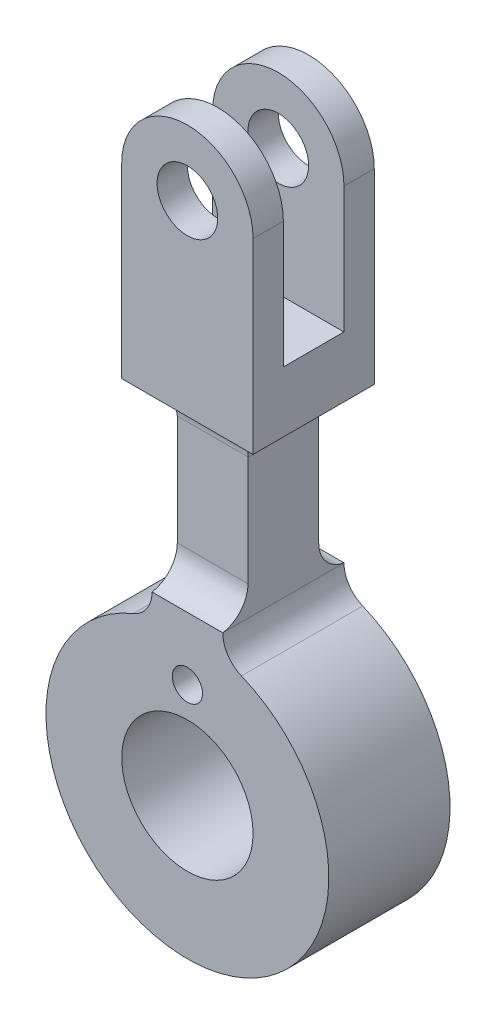
ISO-10303-21;
HEADER;
FILE_DESCRIPTION(('STEP AP214'),'2;1');
FILE_NAME('part.step','',(''),(''),'','','');
FILE_SCHEMA(('AUTOMOTIVE_DESIGN { 1 0 10303 214 1 1 1 1 }'));
ENDSEC;
DATA;
#1=APPLICATION_CONTEXT('core data for automotive mechanical design processes');
#2=APPLICATION_PROTOCOL_DEFINITION('international standard','automotive_design',2000,#1);
#3=PRODUCT_CONTEXT('',#1,'mechanical');
#4=PRODUCT('Part','Part','',(#3));
#5=PRODUCT_RELATED_PRODUCT_CATEGORY('part','',(#4));
#6=PRODUCT_DEFINITION_FORMATION('','',#4);
#7=PRODUCT_DEFINITION_CONTEXT('part definition',#1,'design');
#8=PRODUCT_DEFINITION('design','',#6,#7);
#9=PRODUCT_DEFINITION_SHAPE('','',#8);
#10=(LENGTH_UNIT() NAMED_UNIT(*) SI_UNIT(.MILLI.,.METRE.));
#11=(NAMED_UNIT(*) PLANE_ANGLE_UNIT() SI_UNIT($,.RADIAN.));
#12=(NAMED_UNIT(*) SI_UNIT($,.STERADIAN.) SOLID_ANGLE_UNIT());
#13=UNCERTAINTY_MEASURE_WITH_UNIT(LENGTH_MEASURE(1.E-05),#10,'distance_accuracy_value','');
#14=(GEOMETRIC_REPRESENTATION_CONTEXT(3) GLOBAL_UNCERTAINTY_ASSIGNED_CONTEXT((#13)) GLOBAL_UNIT_ASSIGNED_CONTEXT((#10,
#11,#12)) REPRESENTATION_CONTEXT('',''));
#15=CARTESIAN_POINT('',(0.,0.,0.));
#16=DIRECTION('',(0.,0.,1.));
#17=DIRECTION('',(1.,0.,0.));
#18=AXIS2_PLACEMENT_3D('',#15,#16,#17);
#19=CARTESIAN_POINT('',(-6.5,29.4999999999939,6.));
#20=DIRECTION('',(0.,0.,1.));
#21=DIRECTION('',(1.,0.,0.));
#22=AXIS2_PLACEMENT_3D('',#19,#20,#21);
#23=PLANE('',#22);
#24=DIRECTION('',(1.,0.,0.));
#25=VECTOR('',#24,1.);
#26=CARTESIAN_POINT('',(-14.,32.4999999999939,6.));
#27=LINE('',#26,#25);
#28=CARTESIAN_POINT('',(-6.5,32.4999999999939,6.));
#29=VERTEX_POINT('',#28);
#30=CARTESIAN_POINT('',(6.49999999999999,32.4999999999939,6.));
#31=VERTEX_POINT('',#30);
#32=EDGE_CURVE('E274',#29,#31,#27,.T.);
#33=ORIENTED_EDGE('',*,*,#32,.T.);
#34=DIRECTION('',(0.,1.,0.));
#35=VECTOR('',#34,1.);
#36=CARTESIAN_POINT('',(6.49999999999999,32.4999999999939,6.));
#37=LINE('',#36,#35);
#38=CARTESIAN_POINT('',(6.5,51.,6.));
#39=VERTEX_POINT('',#38);
#40=EDGE_CURVE('E309',#31,#39,#37,.T.);
#41=ORIENTED_EDGE('',*,*,#40,.T.);
#42=CARTESIAN_POINT('',(0.,50.9999999999939,6.));
#43=DIRECTION('',(0.,0.,1.));
#44=DIRECTION('',(-1.,0.,0.));
#45=AXIS2_PLACEMENT_3D('',#42,#43,#44);
#46=CIRCLE('',#45,6.5);
#47=CARTESIAN_POINT('',(-6.5,51.,6.));
#48=VERTEX_POINT('',#47);
#49=EDGE_CURVE('E311',#39,#48,#46,.T.);
#50=ORIENTED_EDGE('',*,*,#49,.T.);
#51=DIRECTION('',(0.,-1.,0.));
#52=VECTOR('',#51,1.);
#53=CARTESIAN_POINT('',(-6.5,32.4999999999939,6.));
#54=LINE('',#53,#52);
#55=EDGE_CURVE('E313',#48,#29,#54,.T.);
#56=ORIENTED_EDGE('',*,*,#55,.T.);
#57=EDGE_LOOP('',(#33,#41,#50,#56));
#58=FACE_BOUND('',#57,.T.);
#59=CARTESIAN_POINT('',(0.,50.9999999999939,6.));
#60=DIRECTION('',(0.,0.,1.));
#61=DIRECTION('',(1.,0.,0.));
#62=AXIS2_PLACEMENT_3D('',#59,#60,#61);
#63=CIRCLE('',#62,3.);
#64=CARTESIAN_POINT('',(3.,50.9999999999939,6.));
#65=VERTEX_POINT('',#64);
#66=EDGE_CURVE('E278',#65,#65,#63,.T.);
#67=ORIENTED_EDGE('',*,*,#66,.F.);
#68=EDGE_LOOP('',(#67));
#69=FACE_BOUND('',#68,.T.);
#70=ADVANCED_FACE('F33',(#58,#69),#23,.T.);
#71=CARTESIAN_POINT('',(-6.5,29.4999999999939,-6.));
#72=DIRECTION('',(0.,0.,1.));
#73=DIRECTION('',(1.,0.,0.));
#74=AXIS2_PLACEMENT_3D('',#71,#72,#73);
#75=PLANE('',#74);
#76=CARTESIAN_POINT('',(0.,9.5,-6.));
#77=DIRECTION('',(0.,0.,1.));
#78=DIRECTION('',(1.,0.,0.));
#79=AXIS2_PLACEMENT_3D('',#76,#77,#78);
#80=CIRCLE('',#79,1.5);
#81=CARTESIAN_POINT('',(1.5,9.5,-6.));
#82=VERTEX_POINT('',#81);
#83=EDGE_CURVE('E280',#82,#82,#80,.T.);
#84=ORIENTED_EDGE('',*,*,#83,.T.);
#85=EDGE_LOOP('',(#84));
#86=FACE_BOUND('',#85,.T.);
#87=CARTESIAN_POINT('',(0.,0.,-6.));
#88=DIRECTION('',(0.,0.,1.));
#89=DIRECTION('',(1.,0.,0.));
#90=AXIS2_PLACEMENT_3D('',#87,#88,#89);
#91=CIRCLE('',#90,6.5);
#92=CARTESIAN_POINT('',(6.5,0.,-6.));
#93=VERTEX_POINT('',#92);
#94=EDGE_CURVE('E293',#93,#93,#91,.T.);
#95=ORIENTED_EDGE('',*,*,#94,.T.);
#96=EDGE_LOOP('',(#95));
#97=FACE_BOUND('',#96,.T.);
#98=CARTESIAN_POINT('',(-6.5,15.708278072405,-6.));
#99=DIRECTION('',(0.,0.,-1.));
#100=DIRECTION('',(-1.,0.,0.));
#101=AXIS2_PLACEMENT_3D('',#98,#99,#100);
#102=CIRCLE('',#101,3.);
#103=CARTESIAN_POINT('',(-3.5,15.708278072405,-6.));
#104=VERTEX_POINT('',#103);
#105=CARTESIAN_POINT('',(-5.35294117647059,12.9362290008041,-6.));
#106=VERTEX_POINT('',#105);
#107=EDGE_CURVE('E298',#104,#106,#102,.T.);
#108=ORIENTED_EDGE('',*,*,#107,.F.);
#109=DIRECTION('',(1.,0.,0.));
#110=VECTOR('',#109,1.);
#111=CARTESIAN_POINT('',(-14.,15.708278072405,-6.));
#112=LINE('',#111,#110);
#113=CARTESIAN_POINT('',(3.5,15.708278072405,-6.));
#114=VERTEX_POINT('',#113);
#115=EDGE_CURVE('E381',#104,#114,#112,.T.);
#116=ORIENTED_EDGE('',*,*,#115,.T.);
#117=CARTESIAN_POINT('',(6.5,15.708278072405,-6.));
#118=DIRECTION('',(0.,0.,-1.));
#119=DIRECTION('',(1.,0.,0.));
#120=AXIS2_PLACEMENT_3D('',#117,#118,#119);
#121=CIRCLE('',#120,3.);
#122=CARTESIAN_POINT('',(5.35294117647059,12.9362290008041,-6.));
#123=VERTEX_POINT('',#122);
#124=EDGE_CURVE('E319',#123,#114,#121,.T.);
#125=ORIENTED_EDGE('',*,*,#124,.F.);
#126=CARTESIAN_POINT('',(0.,0.,-6.));
#127=DIRECTION('',(0.,0.,1.));
#128=DIRECTION('',(1.,0.,0.));
#129=AXIS2_PLACEMENT_3D('',#126,#127,#128);
#130=CIRCLE('',#129,14.);
#131=EDGE_CURVE('E317',#106,#123,#130,.T.);
#132=ORIENTED_EDGE('',*,*,#131,.F.);
#133=EDGE_LOOP('',(#108,#116,#125,#132));
#134=FACE_BOUND('',#133,.T.);
#135=ADVANCED_FACE('F251',(#86,#97,#134),#75,.F.);
#136=CARTESIAN_POINT('',(0.,50.9999999999939,6.));
#137=DIRECTION('',(0.,0.,-1.));
#138=DIRECTION('',(-1.,0.,0.));
#139=AXIS2_PLACEMENT_3D('',#136,#137,#138);
#140=CYLINDRICAL_SURFACE('',#139,6.5);
#141=CARTESIAN_POINT('',(0.,50.9999999999939,3.));
#142=DIRECTION('',(0.,0.,1.));
#143=DIRECTION('',(1.,0.,0.));
#144=AXIS2_PLACEMENT_3D('',#141,#142,#143);
#145=CIRCLE('',#144,6.5);
#146=CARTESIAN_POINT('',(6.5,50.9999999999939,3.));
#147=VERTEX_POINT('',#146);
#148=CARTESIAN_POINT('',(-6.5,51.,3.));
#149=VERTEX_POINT('',#148);
#150=EDGE_CURVE('E161',#147,#149,#145,.T.);
#151=ORIENTED_EDGE('',*,*,#150,.T.);
#152=DIRECTION('',(0.,0.,-1.));
#153=VECTOR('',#152,1.);
#154=CARTESIAN_POINT('',(-6.5,51.,6.));
#155=LINE('',#154,#153);
#156=EDGE_CURVE('E333',#48,#149,#155,.T.);
#157=ORIENTED_EDGE('',*,*,#156,.F.);
#158=ORIENTED_EDGE('',*,*,#49,.F.);
#159=DIRECTION('',(0.,0.,-1.));
#160=VECTOR('',#159,1.);
#161=CARTESIAN_POINT('',(6.5,51.,6.));
#162=LINE('',#161,#160);
#163=EDGE_CURVE('E337',#39,#147,#162,.T.);
#164=ORIENTED_EDGE('',*,*,#163,.T.);
#165=EDGE_LOOP('',(#151,#157,#158,#164));
#166=FACE_BOUND('',#165,.T.);
#167=ADVANCED_FACE('F258',(#166),#140,.T.);
#168=CARTESIAN_POINT('',(0.,50.9999999999939,6.));
#169=DIRECTION('',(0.,0.,-1.));
#170=DIRECTION('',(-1.,0.,0.));
#171=AXIS2_PLACEMENT_3D('',#168,#169,#170);
#172=CYLINDRICAL_SURFACE('',#171,3.);
#173=CARTESIAN_POINT('',(0.,50.9999999999939,-3.));
#174=DIRECTION('',(0.,0.,-1.));
#175=DIRECTION('',(-1.,0.,0.));
#176=AXIS2_PLACEMENT_3D('',#173,#174,#175);
#177=CIRCLE('',#176,3.);
#178=CARTESIAN_POINT('',(-3.,50.9999999999939,-3.));
#179=VERTEX_POINT('',#178);
#180=EDGE_CURVE('E166',#179,#179,#177,.T.);
#181=ORIENTED_EDGE('',*,*,#180,.F.);
#182=EDGE_LOOP('',(#181));
#183=FACE_BOUND('',#182,.T.);
#184=CARTESIAN_POINT('',(0.,50.9999999999939,-6.));
#185=DIRECTION('',(0.,0.,1.));
#186=DIRECTION('',(1.,0.,0.));
#187=AXIS2_PLACEMENT_3D('',#184,#185,#186);
#188=CIRCLE('',#187,3.);
#189=CARTESIAN_POINT('',(3.,50.9999999999939,-6.));
#190=VERTEX_POINT('',#189);
#191=EDGE_CURVE('E281',#190,#190,#188,.T.);
#192=ORIENTED_EDGE('',*,*,#191,.F.);
#193=EDGE_LOOP('',(#192));
#194=FACE_BOUND('',#193,.T.);
#195=ADVANCED_FACE('F234',(#183,#194),#172,.F.);
#196=DIRECTION('',(1.,0.,0.));
#197=VECTOR('',#196,1.);
#198=CARTESIAN_POINT('',(-14.,15.708278072405,6.));
#199=LINE('',#198,#197);
#200=CARTESIAN_POINT('',(-3.5,15.708278072405,6.));
#201=VERTEX_POINT('',#200);
#202=CARTESIAN_POINT('',(3.5,15.708278072405,6.));
#203=VERTEX_POINT('',#202);
#204=EDGE_CURVE('E451',#201,#203,#199,.T.);
#205=ORIENTED_EDGE('',*,*,#204,.F.);
#206=CARTESIAN_POINT('',(-6.5,15.708278072405,6.));
#207=DIRECTION('',(0.,0.,-1.));
#208=DIRECTION('',(-1.,0.,0.));
#209=AXIS2_PLACEMENT_3D('',#206,#207,#208);
#210=CIRCLE('',#209,3.);
#211=CARTESIAN_POINT('',(-5.35294117647059,12.9362290008041,6.));
#212=VERTEX_POINT('',#211);
#213=EDGE_CURVE('E301',#201,#212,#210,.T.);
#214=ORIENTED_EDGE('',*,*,#213,.T.);
#215=CARTESIAN_POINT('',(0.,0.,6.));
#216=DIRECTION('',(0.,0.,1.));
#217=DIRECTION('',(1.,0.,0.));
#218=AXIS2_PLACEMENT_3D('',#215,#216,#217);
#219=CIRCLE('',#218,14.);
#220=CARTESIAN_POINT('',(5.35294117647059,12.9362290008041,6.));
#221=VERTEX_POINT('',#220);
#222=EDGE_CURVE('E303',#212,#221,#219,.T.);
#223=ORIENTED_EDGE('',*,*,#222,.T.);
#224=CARTESIAN_POINT('',(6.5,15.708278072405,6.));
#225=DIRECTION('',(0.,0.,-1.));
#226=DIRECTION('',(1.,0.,0.));
#227=AXIS2_PLACEMENT_3D('',#224,#225,#226);
#228=CIRCLE('',#227,3.);
#229=EDGE_CURVE('E306',#221,#203,#228,.T.);
#230=ORIENTED_EDGE('',*,*,#229,.T.);
#231=EDGE_LOOP('',(#205,#214,#223,#230));
#232=FACE_BOUND('',#231,.T.);
#233=CARTESIAN_POINT('',(0.,9.5,6.));
#234=DIRECTION('',(0.,0.,1.));
#235=DIRECTION('',(1.,0.,0.));
#236=AXIS2_PLACEMENT_3D('',#233,#234,#235);
#237=CIRCLE('',#236,1.5);
#238=CARTESIAN_POINT('',(1.5,9.5,6.));
#239=VERTEX_POINT('',#238);
#240=EDGE_CURVE('E284',#239,#239,#237,.T.);
#241=ORIENTED_EDGE('',*,*,#240,.F.);
#242=EDGE_LOOP('',(#241));
#243=FACE_BOUND('',#242,.T.);
#244=CARTESIAN_POINT('',(0.,0.,6.));
#245=DIRECTION('',(0.,0.,1.));
#246=DIRECTION('',(1.,0.,0.));
#247=AXIS2_PLACEMENT_3D('',#244,#245,#246);
#248=CIRCLE('',#247,6.5);
#249=CARTESIAN_POINT('',(6.5,0.,6.));
#250=VERTEX_POINT('',#249);
#251=EDGE_CURVE('E295',#250,#250,#248,.T.);
#252=ORIENTED_EDGE('',*,*,#251,.F.);
#253=EDGE_LOOP('',(#252));
#254=FACE_BOUND('',#253,.T.);
#255=ADVANCED_FACE('F243',(#232,#243,#254),#23,.T.);
#256=DIRECTION('',(0.,1.,0.));
#257=VECTOR('',#256,1.);
#258=CARTESIAN_POINT('',(6.49999999999999,32.4999999999939,-6.));
#259=LINE('',#258,#257);
#260=CARTESIAN_POINT('',(6.49999999999999,32.4999999999939,-6.));
#261=VERTEX_POINT('',#260);
#262=CARTESIAN_POINT('',(6.5,51.,-6.));
#263=VERTEX_POINT('',#262);
#264=EDGE_CURVE('E322',#261,#263,#259,.T.);
#265=ORIENTED_EDGE('',*,*,#264,.F.);
#266=DIRECTION('',(1.,0.,0.));
#267=VECTOR('',#266,1.);
#268=CARTESIAN_POINT('',(-14.,32.4999999999939,-6.));
#269=LINE('',#268,#267);
#270=CARTESIAN_POINT('',(-6.5,32.4999999999939,-6.));
#271=VERTEX_POINT('',#270);
#272=EDGE_CURVE('E389',#271,#261,#269,.T.);
#273=ORIENTED_EDGE('',*,*,#272,.F.);
#274=DIRECTION('',(0.,-1.,0.));
#275=VECTOR('',#274,1.);
#276=CARTESIAN_POINT('',(-6.5,32.4999999999939,-6.));
#277=LINE('',#276,#275);
#278=CARTESIAN_POINT('',(-6.5,51.,-6.));
#279=VERTEX_POINT('',#278);
#280=EDGE_CURVE('E304',#279,#271,#277,.T.);
#281=ORIENTED_EDGE('',*,*,#280,.F.);
#282=CARTESIAN_POINT('',(0.,50.9999999999939,-6.));
#283=DIRECTION('',(0.,0.,1.));
#284=DIRECTION('',(-1.,0.,0.));
#285=AXIS2_PLACEMENT_3D('',#282,#283,#284);
#286=CIRCLE('',#285,6.5);
#287=EDGE_CURVE('E325',#263,#279,#286,.T.);
#288=ORIENTED_EDGE('',*,*,#287,.F.);
#289=EDGE_LOOP('',(#265,#273,#281,#288));
#290=FACE_BOUND('',#289,.T.);
#291=ORIENTED_EDGE('',*,*,#191,.T.);
#292=EDGE_LOOP('',(#291));
#293=FACE_BOUND('',#292,.T.);
#294=ADVANCED_FACE('F246',(#290,#293),#75,.F.);
#295=CARTESIAN_POINT('',(-6.5,29.4999999999939,6.));
#296=DIRECTION('',(0.,0.,-1.));
#297=DIRECTION('',(-1.,0.,0.));
#298=AXIS2_PLACEMENT_3D('',#295,#296,#297);
#299=CYLINDRICAL_SURFACE('',#298,3.);
#300=CARTESIAN_POINT('',(-6.5,29.4999999999939,3.5));
#301=DIRECTION('',(0.,0.,-1.));
#302=DIRECTION('',(0.,1.,0.));
#303=AXIS2_PLACEMENT_3D('',#300,#301,#302);
#304=CIRCLE('',#303,3.);
#305=CARTESIAN_POINT('',(-3.5,29.4999999999939,3.5));
#306=VERTEX_POINT('',#305);
#307=CARTESIAN_POINT('',(-3.50029345613628,29.541960108444,3.5));
#308=VERTEX_POINT('',#307);
#309=EDGE_CURVE('E410',#306,#308,#304,.F.);
#310=ORIENTED_EDGE('',*,*,#309,.T.);
#311=CARTESIAN_POINT('',(-3.5,29.4999999999939,3.50029345613627));
#312=CARTESIAN_POINT('',(-3.49998330334828,29.5669979029651,3.49933962570523));
#313=CARTESIAN_POINT('',(-3.50224380190486,29.6340158062412,3.50066330146135));
#314=CARTESIAN_POINT('',(-3.51120380816069,29.7674695918802,3.50774655918405));
#315=CARTESIAN_POINT('',(-3.51789999505206,29.8339058720074,3.51350282318705));
#316=CARTESIAN_POINT('',(-3.53554263562656,29.9651283345654,3.52926525332445));
#317=CARTESIAN_POINT('',(-3.54645327654144,30.0299236453092,3.53923567474066));
#318=CARTESIAN_POINT('',(-3.57230617983571,30.1579356350321,3.56319545782947));
#319=CARTESIAN_POINT('',(-3.58724897796362,30.2211521030115,3.57718535358141));
#320=CARTESIAN_POINT('',(-3.63765399990194,30.4074398284925,3.62471014034317));
#321=CARTESIAN_POINT('',(-3.67875994295202,30.5276285780625,3.66386052293696));
#322=CARTESIAN_POINT('',(-3.77360971153534,30.7579343447238,3.75467284927776));
#323=CARTESIAN_POINT('',(-3.82737997423332,30.8680296142028,3.80636097279133));
#324=CARTESIAN_POINT('',(-3.96869055730461,31.1188430816549,3.9424376052017));
#325=CARTESIAN_POINT('',(-4.06113464593573,31.254188917427,4.03163522097977));
#326=CARTESIAN_POINT('',(-4.26057583711766,31.5026192594445,4.22390543525591));
#327=CARTESIAN_POINT('',(-4.36760745724802,31.6156493594406,4.32701093699152));
#328=CARTESIAN_POINT('',(-4.55742323659217,31.7885346654323,4.50916459262957));
#329=CARTESIAN_POINT('',(-4.6374899334485,31.8540324877647,4.58581089869139));
#330=CARTESIAN_POINT('',(-4.80182117828821,31.9752008519672,4.74240433545194));
#331=CARTESIAN_POINT('',(-4.88608782060196,32.0308664267696,4.82235310947606));
#332=CARTESIAN_POINT('',(-5.0580821044487,32.1326500656003,4.98426284082733));
#333=CARTESIAN_POINT('',(-5.14580509617991,32.1787804679923,5.06622104232094));
#334=CARTESIAN_POINT('',(-5.3246014673562,32.2619140677466,5.23100835630212));
#335=CARTESIAN_POINT('',(-5.41567302107018,32.298922156479,5.31383697712096));
#336=CARTESIAN_POINT('',(-5.57472701148625,32.3546020029886,5.45453447484979));
#337=CARTESIAN_POINT('',(-5.64172508341087,32.3754766835973,5.51265941170671));
#338=CARTESIAN_POINT('',(-5.77851668602426,32.4128187447464,5.6272052697386));
#339=CARTESIAN_POINT('',(-5.84831220376676,32.4292829263203,5.68362492789126));
#340=CARTESIAN_POINT('',(-5.97188969919433,32.4536173478656,5.77622092463664));
#341=CARTESIAN_POINT('',(-6.02456460158399,32.4625994983162,5.8135830234733));
#342=CARTESIAN_POINT('',(-6.13370934297968,32.4780652134879,5.88313494155569));
#343=CARTESIAN_POINT('',(-6.19017058141734,32.4845542296461,5.915335954956));
#344=CARTESIAN_POINT('',(-6.28102703454898,32.4921638609688,5.95547350988436));
#345=CARTESIAN_POINT('',(-6.31335765918631,32.4943750584185,5.96770821975155));
#346=CARTESIAN_POINT('',(-6.37954219804113,32.4977605946058,5.9868300192742));
#347=CARTESIAN_POINT('',(-6.4133866077224,32.4989406490495,5.99374656195565));
#348=CARTESIAN_POINT('',(-6.46497797414653,32.4998479602764,5.99910485995833));
#349=CARTESIAN_POINT('',(-6.48248003868139,32.5000038711805,6.00003925375745));
#350=CARTESIAN_POINT('',(-6.5,32.4999999999939,6.));
#351=B_SPLINE_CURVE_WITH_KNOTS('',3,(#311,#312,#313,#314,#315,#316,#317,#318,#319,#320,#321,
#322,#323,#324,#325,#326,#327,#328,#329,#330,#331,#332,#333,#334,#335,#336,#337,#338,#339,#340,
#341,#342,#343,#344,#345,#346,#347,#348,#349,#350),.UNSPECIFIED.,.F.,.F.,(4,2,2,2,2,2,2,2,2,2,2,
2,2,2,2,2,2,2,2,4),(0.,0.200918377899567,0.401686506650293,0.600784841928862,0.799909644231892,
1.19671619514155,1.59435855112963,2.15110137770142,2.70918523389021,3.09494857022886,
3.48090623305858,3.86636130228625,4.25160923932235,4.5248625853302,4.7983135906029,
4.99381043385945,5.1888773413028,5.29249396729694,5.39553252684951,5.44804237537523),.UNSPECIFIED.);
#352=EDGE_CURVE('E422',#308,#29,#351,.T.);
#353=ORIENTED_EDGE('',*,*,#352,.T.);
#354=DIRECTION('',(0.,0.,-1.));
#355=VECTOR('',#354,1.);
#356=CARTESIAN_POINT('',(-6.5,32.4999999999939,6.));
#357=LINE('',#356,#355);
#358=EDGE_CURVE('E315',#29,#271,#357,.T.);
#359=ORIENTED_EDGE('',*,*,#358,.T.);
#360=CARTESIAN_POINT('',(-6.5,32.4999999999939,-6.));
#361=CARTESIAN_POINT('',(-6.46011219595219,32.5000170139715,-6.00020220258163));
#362=CARTESIAN_POINT('',(-6.4207656149449,32.4992058944907,-5.99526403640693));
#363=CARTESIAN_POINT('',(-6.34475097301132,32.496210687868,-5.97798873529558));
#364=CARTESIAN_POINT('',(-6.30804033134792,32.4940618550351,-5.96584194993448));
#365=CARTESIAN_POINT('',(-6.23312787899418,32.4883700370317,-5.93526765947448));
#366=CARTESIAN_POINT('',(-6.19516513657812,32.484705752511,-5.91632012638083));
#367=CARTESIAN_POINT('',(-6.12121502262044,32.4762223528403,-5.87505324984263));
#368=CARTESIAN_POINT('',(-6.08523176491494,32.4714009366605,-5.85272722114861));
#369=CARTESIAN_POINT('',(-5.97798294996761,32.4551365000191,-5.78183673164551));
#370=CARTESIAN_POINT('',(-5.90905416897664,32.4420314163697,-5.73018877530061));
#371=CARTESIAN_POINT('',(-5.73513812365328,32.4029151815856,-5.5930158492971));
#372=CARTESIAN_POINT('',(-5.63262309245858,32.373837634784,-5.50533453052924));
#373=CARTESIAN_POINT('',(-5.43203069871418,32.30546116522,-5.3286232852055));
#374=CARTESIAN_POINT('',(-5.33396006301927,32.2661473184623,-5.2395915698214));
#375=CARTESIAN_POINT('',(-5.14259117711854,32.1773999784435,-5.06329917589627));
#376=CARTESIAN_POINT('',(-5.04925876481,32.128057732103,-4.97602982345558));
#377=CARTESIAN_POINT('',(-4.86672410992396,32.0186731128944,-4.80404028041287));
#378=CARTESIAN_POINT('',(-4.77751846097399,31.9586397707788,-4.71931800834758));
#379=CARTESIAN_POINT('',(-4.62876791027796,31.8461702174013,-4.57742421516953));
#380=CARTESIAN_POINT('',(-4.56804397867438,31.7964808184276,-4.51931024569492));
#381=CARTESIAN_POINT('',(-4.44944197567755,31.6912337311618,-4.40557067894227));
#382=CARTESIAN_POINT('',(-4.39156409611753,31.6356756480936,-4.34994524942272));
#383=CARTESIAN_POINT('',(-4.2229061492205,31.4598933714513,-4.18765713137829));
#384=CARTESIAN_POINT('',(-4.1169813048437,31.3304721686857,-4.08546720512606));
#385=CARTESIAN_POINT('',(-3.94669382030111,31.0804416869512,-3.92126636660153));
#386=CARTESIAN_POINT('',(-3.87842441419374,30.9649754021344,-3.85546699673446));
#387=CARTESIAN_POINT('',(-3.75596677583539,30.7202140264183,-3.73774110123263));
#388=CARTESIAN_POINT('',(-3.70176275668927,30.5909346714116,-3.68579902041299));
#389=CARTESIAN_POINT('',(-3.61813652797976,30.3421855663187,-3.60622828204316));
#390=CARTESIAN_POINT('',(-3.58615187518094,30.224393498049,-3.57605471712693));
#391=CARTESIAN_POINT('',(-3.53662598809029,29.9831910095859,-3.53010282198872));
#392=CARTESIAN_POINT('',(-3.51905170448969,29.859794134138,-3.51429154369632));
#393=CARTESIAN_POINT('',(-3.5067201736781,29.7032972841674,-3.50416587813762));
#394=CARTESIAN_POINT('',(-3.50470603628842,29.6710659234373,-3.50260446424562));
#395=CARTESIAN_POINT('',(-3.50171993106708,29.6065495048223,-3.50052283609886));
#396=CARTESIAN_POINT('',(-3.50074705843696,29.5742645180114,-3.50000171754672));
#397=CARTESIAN_POINT('',(-3.50029345613628,29.541960108444,-3.5));
#398=B_SPLINE_CURVE_WITH_KNOTS('',3,(#360,#361,#362,#363,#364,#365,#366,#367,#368,#369,#370,
#371,#372,#373,#374,#375,#376,#377,#378,#379,#380,#381,#382,#383,#384,#385,#386,#387,#388,#389,
#390,#391,#392,#393,#394,#395,#396,#397),.UNSPECIFIED.,.F.,.F.,(4,2,2,2,2,2,2,2,2,2,2,2,2,2,2,2,
2,2,4),(0.,0.118520883824147,0.234043269939172,0.361525072809657,0.489262513025942,
0.75020397147785,1.16366319598193,1.57772863126905,1.98818287023738,2.39829202958971,
2.69097045169683,2.98366857432252,3.56850282363083,4.01515558996135,4.46130484639346,
4.83695864607649,5.21174847762425,5.30872297747008,5.40561314353629),.UNSPECIFIED.);
#399=CARTESIAN_POINT('',(-3.50029345613628,29.541960108444,-3.5));
#400=VERTEX_POINT('',#399);
#401=EDGE_CURVE('E185',#271,#400,#398,.T.);
#402=ORIENTED_EDGE('',*,*,#401,.T.);
#403=CARTESIAN_POINT('',(-6.5,29.4999999999939,-3.5));
#404=DIRECTION('',(0.,0.,1.));
#405=DIRECTION('',(0.,-1.,0.));
#406=AXIS2_PLACEMENT_3D('',#403,#404,#405);
#407=CIRCLE('',#406,3.);
#408=CARTESIAN_POINT('',(-3.5,29.4999999999939,-3.5));
#409=VERTEX_POINT('',#408);
#410=EDGE_CURVE('E417',#400,#409,#407,.F.);
#411=ORIENTED_EDGE('',*,*,#410,.T.);
#412=DIRECTION('',(0.,0.,-1.));
#413=VECTOR('',#412,1.);
#414=CARTESIAN_POINT('',(-3.5,29.4999999999939,6.));
#415=LINE('',#414,#413);
#416=EDGE_CURVE('E357',#306,#409,#415,.T.);
#417=ORIENTED_EDGE('',*,*,#416,.F.);
#418=EDGE_LOOP('',(#310,#353,#359,#402,#411,#417));
#419=FACE_BOUND('',#418,.T.);
#420=ADVANCED_FACE('F35',(#419),#299,.F.);
#421=CARTESIAN_POINT('',(-3.5,15.708278072405,6.));
#422=DIRECTION('',(1.,0.,0.));
#423=DIRECTION('',(0.,1.,0.));
#424=AXIS2_PLACEMENT_3D('',#421,#422,#423);
#425=PLANE('',#424);
#426=CARTESIAN_POINT('',(-3.5,18.6663179639548,6.5));
#427=DIRECTION('',(1.,0.,0.));
#428=DIRECTION('',(0.,1.,0.));
#429=AXIS2_PLACEMENT_3D('',#426,#427,#428);
#430=CIRCLE('',#429,3.);
#431=CARTESIAN_POINT('',(-3.5,18.6663179639548,3.5));
#432=VERTEX_POINT('',#431);
#433=EDGE_CURVE('E287',#201,#432,#430,.T.);
#434=ORIENTED_EDGE('',*,*,#433,.T.);
#435=DIRECTION('',(0.,1.,0.));
#436=VECTOR('',#435,1.);
#437=CARTESIAN_POINT('',(-3.5,15.708278072405,3.5));
#438=LINE('',#437,#436);
#439=EDGE_CURVE('E412',#432,#306,#438,.T.);
#440=ORIENTED_EDGE('',*,*,#439,.T.);
#441=ORIENTED_EDGE('',*,*,#416,.T.);
#442=DIRECTION('',(0.,-1.,0.));
#443=VECTOR('',#442,1.);
#444=CARTESIAN_POINT('',(-3.5,15.708278072405,-3.5));
#445=LINE('',#444,#443);
#446=CARTESIAN_POINT('',(-3.5,18.6663179639548,-3.5));
#447=VERTEX_POINT('',#446);
#448=EDGE_CURVE('E409',#409,#447,#445,.T.);
#449=ORIENTED_EDGE('',*,*,#448,.T.);
#450=CARTESIAN_POINT('',(-3.5,18.6663179639548,-6.5));
#451=DIRECTION('',(1.,0.,0.));
#452=DIRECTION('',(0.,1.,0.));
#453=AXIS2_PLACEMENT_3D('',#450,#451,#452);
#454=CIRCLE('',#453,3.);
#455=EDGE_CURVE('E408',#447,#104,#454,.T.);
#456=ORIENTED_EDGE('',*,*,#455,.T.);
#457=DIRECTION('',(0.,0.,-1.));
#458=VECTOR('',#457,1.);
#459=CARTESIAN_POINT('',(-3.5,15.708278072405,6.));
#460=LINE('',#459,#458);
#461=EDGE_CURVE('E354',#201,#104,#460,.T.);
#462=ORIENTED_EDGE('',*,*,#461,.F.);
#463=EDGE_LOOP('',(#434,#440,#441,#449,#456,#462));
#464=FACE_BOUND('',#463,.T.);
#465=ADVANCED_FACE('F405',(#464),#425,.F.);
#466=CARTESIAN_POINT('',(-6.5,15.708278072405,6.));
#467=DIRECTION('',(0.,0.,-1.));
#468=DIRECTION('',(-1.,0.,0.));
#469=AXIS2_PLACEMENT_3D('',#466,#467,#468);
#470=CYLINDRICAL_SURFACE('',#469,3.);
#471=ORIENTED_EDGE('',*,*,#107,.T.);
#472=DIRECTION('',(0.,0.,-1.));
#473=VECTOR('',#472,1.);
#474=CARTESIAN_POINT('',(-5.35294117647059,12.9362290008041,6.));
#475=LINE('',#474,#473);
#476=EDGE_CURVE('E351',#212,#106,#475,.T.);
#477=ORIENTED_EDGE('',*,*,#476,.F.);
#478=ORIENTED_EDGE('',*,*,#213,.F.);
#479=ORIENTED_EDGE('',*,*,#461,.T.);
#480=EDGE_LOOP('',(#471,#477,#478,#479));
#481=FACE_BOUND('',#480,.T.);
#482=ADVANCED_FACE('F401',(#481),#470,.F.);
#483=CARTESIAN_POINT('',(0.,0.,6.));
#484=DIRECTION('',(0.,0.,-1.));
#485=DIRECTION('',(-1.,0.,0.));
#486=AXIS2_PLACEMENT_3D('',#483,#484,#485);
#487=CYLINDRICAL_SURFACE('',#486,14.);
#488=ORIENTED_EDGE('',*,*,#131,.T.);
#489=DIRECTION('',(0.,0.,-1.));
#490=VECTOR('',#489,1.);
#491=CARTESIAN_POINT('',(5.35294117647059,12.9362290008041,6.));
#492=LINE('',#491,#490);
#493=EDGE_CURVE('E348',#221,#123,#492,.T.);
#494=ORIENTED_EDGE('',*,*,#493,.F.);
#495=ORIENTED_EDGE('',*,*,#222,.F.);
#496=ORIENTED_EDGE('',*,*,#476,.T.);
#497=EDGE_LOOP('',(#488,#494,#495,#496));
#498=FACE_BOUND('',#497,.T.);
#499=ADVANCED_FACE('F397',(#498),#487,.T.);
#500=CARTESIAN_POINT('',(6.5,15.708278072405,6.));
#501=DIRECTION('',(0.,0.,-1.));
#502=DIRECTION('',(-1.,0.,0.));
#503=AXIS2_PLACEMENT_3D('',#500,#501,#502);
#504=CYLINDRICAL_SURFACE('',#503,3.);
#505=ORIENTED_EDGE('',*,*,#124,.T.);
#506=DIRECTION('',(0.,0.,-1.));
#507=VECTOR('',#506,1.);
#508=CARTESIAN_POINT('',(3.5,15.708278072405,6.));
#509=LINE('',#508,#507);
#510=EDGE_CURVE('E345',#203,#114,#509,.T.);
#511=ORIENTED_EDGE('',*,*,#510,.F.);
#512=ORIENTED_EDGE('',*,*,#229,.F.);
#513=ORIENTED_EDGE('',*,*,#493,.T.);
#514=EDGE_LOOP('',(#505,#511,#512,#513));
#515=FACE_BOUND('',#514,.T.);
#516=ADVANCED_FACE('F392',(#515),#504,.F.);
#517=CARTESIAN_POINT('',(3.5,15.708278072405,6.));
#518=DIRECTION('',(-1.,0.,0.));
#519=DIRECTION('',(0.,-1.,0.));
#520=AXIS2_PLACEMENT_3D('',#517,#518,#519);
#521=PLANE('',#520);
#522=DIRECTION('',(0.,0.,-1.));
#523=VECTOR('',#522,1.);
#524=CARTESIAN_POINT('',(3.5,29.4999999999939,6.));
#525=LINE('',#524,#523);
#526=CARTESIAN_POINT('',(3.5,29.4999999999939,3.5));
#527=VERTEX_POINT('',#526);
#528=CARTESIAN_POINT('',(3.5,29.4999999999939,-3.5));
#529=VERTEX_POINT('',#528);
#530=EDGE_CURVE('E342',#527,#529,#525,.T.);
#531=ORIENTED_EDGE('',*,*,#530,.F.);
#532=DIRECTION('',(0.,-1.,0.));
#533=VECTOR('',#532,1.);
#534=CARTESIAN_POINT('',(3.5,15.708278072405,3.5));
#535=LINE('',#534,#533);
#536=CARTESIAN_POINT('',(3.5,18.6663179639548,3.5));
#537=VERTEX_POINT('',#536);
#538=EDGE_CURVE('E49',#527,#537,#535,.T.);
#539=ORIENTED_EDGE('',*,*,#538,.T.);
#540=CARTESIAN_POINT('',(3.5,18.6663179639548,6.5));
#541=DIRECTION('',(-1.,0.,0.));
#542=DIRECTION('',(0.,-1.,0.));
#543=AXIS2_PLACEMENT_3D('',#540,#541,#542);
#544=CIRCLE('',#543,3.);
#545=EDGE_CURVE('E11',#537,#203,#544,.T.);
#546=ORIENTED_EDGE('',*,*,#545,.T.);
#547=ORIENTED_EDGE('',*,*,#510,.T.);
#548=CARTESIAN_POINT('',(3.5,18.6663179639548,-6.5));
#549=DIRECTION('',(-1.,0.,0.));
#550=DIRECTION('',(0.,-1.,0.));
#551=AXIS2_PLACEMENT_3D('',#548,#549,#550);
#552=CIRCLE('',#551,3.);
#553=CARTESIAN_POINT('',(3.5,18.6663179639548,-3.5));
#554=VERTEX_POINT('',#553);
#555=EDGE_CURVE('E42',#114,#554,#552,.T.);
#556=ORIENTED_EDGE('',*,*,#555,.T.);
#557=DIRECTION('',(0.,1.,0.));
#558=VECTOR('',#557,1.);
#559=CARTESIAN_POINT('',(3.5,15.708278072405,-3.5));
#560=LINE('',#559,#558);
#561=EDGE_CURVE('E377',#554,#529,#560,.T.);
#562=ORIENTED_EDGE('',*,*,#561,.T.);
#563=EDGE_LOOP('',(#531,#539,#546,#547,#556,#562));
#564=FACE_BOUND('',#563,.T.);
#565=ADVANCED_FACE('F263',(#564),#521,.F.);
#566=CARTESIAN_POINT('',(6.5,29.4999999999939,6.));
#567=DIRECTION('',(0.,0.,-1.));
#568=DIRECTION('',(-1.,0.,0.));
#569=AXIS2_PLACEMENT_3D('',#566,#567,#568);
#570=CYLINDRICAL_SURFACE('',#569,3.);
#571=DIRECTION('',(0.,0.,-1.));
#572=VECTOR('',#571,1.);
#573=CARTESIAN_POINT('',(6.49999999999999,32.4999999999939,6.));
#574=LINE('',#573,#572);
#575=EDGE_CURVE('E339',#31,#261,#574,.T.);
#576=ORIENTED_EDGE('',*,*,#575,.F.);
#577=CARTESIAN_POINT('',(6.49999999999999,32.4999999999939,6.));
#578=CARTESIAN_POINT('',(6.46011218859162,32.5000170139726,6.00020220261009));
#579=CARTESIAN_POINT('',(6.42076560051413,32.4992058941938,5.99526403460806));
#580=CARTESIAN_POINT('',(6.34475095922997,32.4962106870655,5.97798873077026));
#581=CARTESIAN_POINT('',(6.30804032466981,32.4940618545303,5.96584194723239));
#582=CARTESIAN_POINT('',(6.23312789432958,32.4883700381939,5.93526766570748));
#583=CARTESIAN_POINT('',(6.19516516618925,32.4847057553625,5.91632014109598));
#584=CARTESIAN_POINT('',(6.12121507951508,32.4762223599096,5.87505328336783));
#585=CARTESIAN_POINT('',(6.08523183481051,32.4714009462622,5.85272726501198));
#586=CARTESIAN_POINT('',(5.97798300259161,32.4551365100561,5.7818367713561));
#587=CARTESIAN_POINT('',(5.90905419485197,32.4420314221497,5.7301887954786));
#588=CARTESIAN_POINT('',(5.73513782762396,32.4029151150671,5.59301561617522));
#589=CARTESIAN_POINT('',(5.63262252224803,32.3738374735434,5.5053340455211));
#590=CARTESIAN_POINT('',(5.43202959906572,32.3054607574188,5.3286223002495));
#591=CARTESIAN_POINT('',(5.33395870814538,32.2661467587327,5.23959033680927));
#592=CARTESIAN_POINT('',(5.14258986612248,32.1773993024605,5.06329795315514));
#593=CARTESIAN_POINT('',(5.04925773120077,32.1280571498172,4.97602885344017));
#594=CARTESIAN_POINT('',(4.86672361010494,32.0186727763212,4.80403980567371));
#595=CARTESIAN_POINT('',(4.77751821755394,31.9586395862309,4.71931777615412));
#596=CARTESIAN_POINT('',(4.62876861986268,31.8461707542711,4.5774248920412));
#597=CARTESIAN_POINT('',(4.56804537006171,31.7964819580556,4.51931157724224));
#598=CARTESIAN_POINT('',(4.44944466139005,31.6912362096543,4.40557325733555));
#599=CARTESIAN_POINT('',(4.3915673943021,31.6356788627955,4.34994841994201));
#600=CARTESIAN_POINT('',(4.22290857946054,31.4598963490108,4.18765947614465));
#601=CARTESIAN_POINT('',(4.11698242201856,31.3304738492626,4.08546828193378));
#602=CARTESIAN_POINT('',(3.94669110096753,31.0804376634579,3.92126374479872));
#603=CARTESIAN_POINT('',(3.87841936656412,30.9649667670413,3.85546213302036));
#604=CARTESIAN_POINT('',(3.75596278985167,30.7202046125068,3.7377372802352));
#605=CARTESIAN_POINT('',(3.70176113152848,30.5909301152821,3.68579747002919));
#606=CARTESIAN_POINT('',(3.61822014433062,30.3424340524993,3.6063078467736));
#607=CARTESIAN_POINT('',(3.5862917572786,30.2249078244504,3.57618669049526));
#608=CARTESIAN_POINT('',(3.53680793090815,29.9842419068277,3.5302694781037));
#609=CARTESIAN_POINT('',(3.51922226226552,29.8611146040145,3.51444328570453));
#610=CARTESIAN_POINT('',(3.50625406619112,29.6976447637138,3.5037795079503));
#611=CARTESIAN_POINT('',(3.50390946242518,29.6581576082336,3.50198915576031));
#612=CARTESIAN_POINT('',(3.50078391677613,29.5791155153061,3.49997092285269));
#613=CARTESIAN_POINT('',(3.50000163676478,29.5395606649311,3.4997417046199));
#614=CARTESIAN_POINT('',(3.49999999999999,29.4999999999939,3.50029345613627));
#615=B_SPLINE_CURVE_WITH_KNOTS('',3,(#577,#578,#579,#580,#581,#582,#583,#584,#585,#586,#587,
#588,#589,#590,#591,#592,#593,#594,#595,#596,#597,#598,#599,#600,#601,#602,#603,#604,#605,#606,
#607,#608,#609,#610,#611,#612,#613,#614),.UNSPECIFIED.,.F.,.F.,(4,2,2,2,2,2,2,2,2,2,2,2,2,2,2,2,
2,2,4),(0.,0.11852090533876,0.234043269894955,0.361525023134407,0.489262413364398,
0.750203971399328,1.16366434263119,1.57773092658168,1.98818401850409,2.39829202951857,
2.6909671003496,2.98366186677471,3.56850280554685,4.01517198448116,4.46130483782491,
4.83613656816495,5.2101762306579,5.32892278423854,5.44756758786003),.UNSPECIFIED.);
#616=CARTESIAN_POINT('',(3.50029345613627,29.541960108444,3.5));
#617=VERTEX_POINT('',#616);
#618=EDGE_CURVE('E428',#31,#617,#615,.T.);
#619=ORIENTED_EDGE('',*,*,#618,.T.);
#620=CARTESIAN_POINT('',(6.5,29.4999999999939,3.5));
#621=DIRECTION('',(0.,0.,-1.));
#622=DIRECTION('',(0.,1.,0.));
#623=AXIS2_PLACEMENT_3D('',#620,#621,#622);
#624=CIRCLE('',#623,3.);
#625=EDGE_CURVE('E372',#617,#527,#624,.F.);
#626=ORIENTED_EDGE('',*,*,#625,.T.);
#627=ORIENTED_EDGE('',*,*,#530,.T.);
#628=CARTESIAN_POINT('',(6.5,29.4999999999939,-3.5));
#629=DIRECTION('',(0.,0.,1.));
#630=DIRECTION('',(0.,-1.,0.));
#631=AXIS2_PLACEMENT_3D('',#628,#629,#630);
#632=CIRCLE('',#631,3.);
#633=CARTESIAN_POINT('',(3.50029345613627,29.541960108444,-3.5));
#634=VERTEX_POINT('',#633);
#635=EDGE_CURVE('E369',#529,#634,#632,.F.);
#636=ORIENTED_EDGE('',*,*,#635,.T.);
#637=CARTESIAN_POINT('',(3.50029345613627,29.541960108444,-3.5));
#638=CARTESIAN_POINT('',(3.50122141696653,29.609509877181,-3.4999831185276));
#639=CARTESIAN_POINT('',(3.5044641353084,29.677013245795,-3.50228088449022));
#640=CARTESIAN_POINT('',(3.51543939294935,29.8112963239332,-3.51136218507708));
#641=CARTESIAN_POINT('',(3.5231682680414,29.8780765787909,-3.51814205942811));
#642=CARTESIAN_POINT('',(3.54289347813181,30.0098293975245,-3.53596800549419));
#643=CARTESIAN_POINT('',(3.55485278908158,30.0748125311555,-3.54697713321947));
#644=CARTESIAN_POINT('',(3.58280859305806,30.2030708483449,-3.57301844769733));
#645=CARTESIAN_POINT('',(3.59880570231247,30.2663457695718,-3.58805124854305));
#646=CARTESIAN_POINT('',(3.65233811469054,30.4525906187489,-3.63866729815013));
#647=CARTESIAN_POINT('',(3.69549555038249,30.5725012462422,-3.67984191969978));
#648=CARTESIAN_POINT('',(3.79431687607366,30.8019109434189,-3.77456101042993));
#649=CARTESIAN_POINT('',(3.85000825456658,30.9113863645814,-3.82813267526469));
#650=CARTESIAN_POINT('',(3.99663180799579,31.1619433579835,-3.96938151040838));
#651=CARTESIAN_POINT('',(4.09259980802101,31.2972997245707,-4.06198829460279));
#652=CARTESIAN_POINT('',(4.29905742740896,31.5449883229675,-4.26097507242464));
#653=CARTESIAN_POINT('',(4.40958073366487,31.6572655474023,-4.36738700800244));
#654=CARTESIAN_POINT('',(4.60514000964998,31.8282481230015,-4.55485006929522));
#655=CARTESIAN_POINT('',(4.6874635581301,31.8927738161742,-4.63354421442153));
#656=CARTESIAN_POINT('',(4.85625667548655,32.0117271960433,-4.79406151854636));
#657=CARTESIAN_POINT('',(4.94272641374213,32.066154469758,-4.87588480534823));
#658=CARTESIAN_POINT('',(5.11917910233556,32.1652507730961,-5.04135702836423));
#659=CARTESIAN_POINT('',(5.20915813966022,32.2099303247359,-5.12500388775791));
#660=CARTESIAN_POINT('',(5.39268042766696,32.2899625607118,-5.29289618193631));
#661=CARTESIAN_POINT('',(5.48622415688353,32.3253139877302,-5.37714169584244));
#662=CARTESIAN_POINT('',(5.64421113978033,32.3760880230708,-5.51457617398077));
#663=CARTESIAN_POINT('',(5.70735818791238,32.3941522113698,-5.56829776592584));
#664=CARTESIAN_POINT('',(5.83629743805951,32.4264200126688,-5.67362833758465));
#665=CARTESIAN_POINT('',(5.90208649762715,32.4406280647151,-5.72523968787601));
#666=CARTESIAN_POINT('',(6.01218692425311,32.4603808601437,-5.80444117967967));
#667=CARTESIAN_POINT('',(6.05508878990505,32.4671606405767,-5.83366870901355));
#668=CARTESIAN_POINT('',(6.14356340620473,32.4790853766625,-5.88838911341037));
#669=CARTESIAN_POINT('',(6.18913630969288,32.4842302386547,-5.91388177446641));
#670=CARTESIAN_POINT('',(6.26840601373256,32.4912182073416,-5.95036090752288));
#671=CARTESIAN_POINT('',(6.30109807025114,32.4935907962449,-5.96336315225441));
#672=CARTESIAN_POINT('',(6.36810406713146,32.4972833456767,-5.98407082274073));
#673=CARTESIAN_POINT('',(6.40240791828242,32.4986091169381,-5.99180545482784));
#674=CARTESIAN_POINT('',(6.45796850306446,32.4997804897744,-5.998705754439));
#675=CARTESIAN_POINT('',(6.47896259514091,32.5000058275249,-6.00006028436849));
#676=CARTESIAN_POINT('',(6.49999999999999,32.4999999999939,-6.));
#677=B_SPLINE_CURVE_WITH_KNOTS('',3,(#637,#638,#639,#640,#641,#642,#643,#644,#645,#646,#647,
#648,#649,#650,#651,#652,#653,#654,#655,#656,#657,#658,#659,#660,#661,#662,#663,#664,#665,#666,
#667,#668,#669,#670,#671,#672,#673,#674,#675,#676),.UNSPECIFIED.,.F.,.F.,(4,2,2,2,2,2,2,2,2,2,2,
2,2,2,2,2,2,2,2,4),(0.,0.202567642995848,0.404970064972761,0.605643222130196,0.806347023513357,
1.20618000727895,1.60689857037465,2.17382978799358,2.74209696356836,3.13430427762675,
3.52652762772726,3.91832548080465,4.31017611652832,4.56463958782998,4.81880887530192,
4.97576397663352,5.13272806793324,5.23823241919696,5.34314693130507,5.4061476444861),.UNSPECIFIED.);
#678=EDGE_CURVE('E182',#634,#261,#677,.T.);
#679=ORIENTED_EDGE('',*,*,#678,.T.);
#680=EDGE_LOOP('',(#576,#619,#626,#627,#636,#679));
#681=FACE_BOUND('',#680,.T.);
#682=ADVANCED_FACE('F202',(#681),#570,.F.);
#683=CARTESIAN_POINT('',(6.49999999999999,32.4999999999939,6.));
#684=DIRECTION('',(-1.,0.,0.));
#685=DIRECTION('',(0.,-1.,0.));
#686=AXIS2_PLACEMENT_3D('',#683,#684,#685);
#687=PLANE('',#686);
#688=CARTESIAN_POINT('',(6.5,51.,-3.));
#689=VERTEX_POINT('',#688);
#690=EDGE_CURVE('E336',#689,#263,#162,.T.);
#691=ORIENTED_EDGE('',*,*,#690,.F.);
#692=DIRECTION('',(0.,-1.,0.));
#693=VECTOR('',#692,1.);
#694=CARTESIAN_POINT('',(6.49999999999999,32.4999999999939,-3.));
#695=LINE('',#694,#693);
#696=CARTESIAN_POINT('',(6.5,38.4999999999939,-3.));
#697=VERTEX_POINT('',#696);
#698=EDGE_CURVE('E181',#689,#697,#695,.T.);
#699=ORIENTED_EDGE('',*,*,#698,.T.);
#700=DIRECTION('',(0.,0.,1.));
#701=VECTOR('',#700,1.);
#702=CARTESIAN_POINT('',(6.5,38.4999999999939,6.));
#703=LINE('',#702,#701);
#704=CARTESIAN_POINT('',(6.5,38.4999999999939,3.));
#705=VERTEX_POINT('',#704);
#706=EDGE_CURVE('E171',#697,#705,#703,.T.);
#707=ORIENTED_EDGE('',*,*,#706,.T.);
#708=DIRECTION('',(0.,1.,0.));
#709=VECTOR('',#708,1.);
#710=CARTESIAN_POINT('',(6.49999999999999,32.4999999999939,3.));
#711=LINE('',#710,#709);
#712=EDGE_CURVE('E159',#705,#147,#711,.T.);
#713=ORIENTED_EDGE('',*,*,#712,.T.);
#714=ORIENTED_EDGE('',*,*,#163,.F.);
#715=ORIENTED_EDGE('',*,*,#40,.F.);
#716=ORIENTED_EDGE('',*,*,#575,.T.);
#717=ORIENTED_EDGE('',*,*,#264,.T.);
#718=EDGE_LOOP('',(#691,#699,#707,#713,#714,#715,#716,#717));
#719=FACE_BOUND('',#718,.T.);
#720=ADVANCED_FACE('F180',(#719),#687,.F.);
#721=CARTESIAN_POINT('',(-6.5,51.,-3.));
#722=VERTEX_POINT('',#721);
#723=EDGE_CURVE('E332',#722,#279,#155,.T.);
#724=ORIENTED_EDGE('',*,*,#723,.F.);
#725=CARTESIAN_POINT('',(0.,50.9999999999939,-3.));
#726=DIRECTION('',(0.,0.,-1.));
#727=DIRECTION('',(-1.,0.,0.));
#728=AXIS2_PLACEMENT_3D('',#725,#726,#727);
#729=CIRCLE('',#728,6.5);
#730=EDGE_CURVE('E187',#722,#689,#729,.T.);
#731=ORIENTED_EDGE('',*,*,#730,.T.);
#732=ORIENTED_EDGE('',*,*,#690,.T.);
#733=ORIENTED_EDGE('',*,*,#287,.T.);
#734=EDGE_LOOP('',(#724,#731,#732,#733));
#735=FACE_BOUND('',#734,.T.);
#736=ADVANCED_FACE('F254',(#735),#140,.T.);
#737=CARTESIAN_POINT('',(-6.5,32.4999999999939,6.));
#738=DIRECTION('',(1.,0.,0.));
#739=DIRECTION('',(0.,1.,0.));
#740=AXIS2_PLACEMENT_3D('',#737,#738,#739);
#741=PLANE('',#740);
#742=DIRECTION('',(0.,0.,-1.));
#743=VECTOR('',#742,1.);
#744=CARTESIAN_POINT('',(-6.5,38.4999999999939,6.));
#745=LINE('',#744,#743);
#746=CARTESIAN_POINT('',(-6.5,38.4999999999939,3.));
#747=VERTEX_POINT('',#746);
#748=CARTESIAN_POINT('',(-6.5,38.4999999999939,-3.));
#749=VERTEX_POINT('',#748);
#750=EDGE_CURVE('E174',#747,#749,#745,.T.);
#751=ORIENTED_EDGE('',*,*,#750,.T.);
#752=DIRECTION('',(0.,1.,0.));
#753=VECTOR('',#752,1.);
#754=CARTESIAN_POINT('',(-6.5,32.4999999999939,-3.));
#755=LINE('',#754,#753);
#756=EDGE_CURVE('E367',#749,#722,#755,.T.);
#757=ORIENTED_EDGE('',*,*,#756,.T.);
#758=ORIENTED_EDGE('',*,*,#723,.T.);
#759=ORIENTED_EDGE('',*,*,#280,.T.);
#760=ORIENTED_EDGE('',*,*,#358,.F.);
#761=ORIENTED_EDGE('',*,*,#55,.F.);
#762=ORIENTED_EDGE('',*,*,#156,.T.);
#763=DIRECTION('',(0.,-1.,0.));
#764=VECTOR('',#763,1.);
#765=CARTESIAN_POINT('',(-6.5,32.4999999999939,3.));
#766=LINE('',#765,#764);
#767=EDGE_CURVE('E363',#149,#747,#766,.T.);
#768=ORIENTED_EDGE('',*,*,#767,.T.);
#769=EDGE_LOOP('',(#751,#757,#758,#759,#760,#761,#762,#768));
#770=FACE_BOUND('',#769,.T.);
#771=ADVANCED_FACE('F241',(#770),#741,.F.);
#772=CARTESIAN_POINT('',(0.,0.,6.));
#773=DIRECTION('',(0.,0.,-1.));
#774=DIRECTION('',(-1.,0.,0.));
#775=AXIS2_PLACEMENT_3D('',#772,#773,#774);
#776=CYLINDRICAL_SURFACE('',#775,6.5);
#777=ORIENTED_EDGE('',*,*,#251,.T.);
#778=EDGE_LOOP('',(#777));
#779=FACE_BOUND('',#778,.T.);
#780=ORIENTED_EDGE('',*,*,#94,.F.);
#781=EDGE_LOOP('',(#780));
#782=FACE_BOUND('',#781,.T.);
#783=ADVANCED_FACE('F237',(#779,#782),#776,.F.);
#784=CARTESIAN_POINT('',(0.,9.5,6.));
#785=DIRECTION('',(0.,0.,-1.));
#786=DIRECTION('',(-1.,0.,0.));
#787=AXIS2_PLACEMENT_3D('',#784,#785,#786);
#788=CYLINDRICAL_SURFACE('',#787,1.5);
#789=ORIENTED_EDGE('',*,*,#240,.T.);
#790=EDGE_LOOP('',(#789));
#791=FACE_BOUND('',#790,.T.);
#792=ORIENTED_EDGE('',*,*,#83,.F.);
#793=EDGE_LOOP('',(#792));
#794=FACE_BOUND('',#793,.T.);
#795=ADVANCED_FACE('F232',(#791,#794),#788,.F.);
#796=CARTESIAN_POINT('',(0.,50.9999999999939,3.));
#797=DIRECTION('',(0.,0.,1.));
#798=DIRECTION('',(1.,0.,0.));
#799=AXIS2_PLACEMENT_3D('',#796,#797,#798);
#800=CIRCLE('',#799,3.);
#801=CARTESIAN_POINT('',(3.,50.9999999999939,3.));
#802=VERTEX_POINT('',#801);
#803=EDGE_CURVE('E360',#802,#802,#800,.T.);
#804=ORIENTED_EDGE('',*,*,#803,.F.);
#805=EDGE_LOOP('',(#804));
#806=FACE_BOUND('',#805,.T.);
#807=ORIENTED_EDGE('',*,*,#66,.T.);
#808=EDGE_LOOP('',(#807));
#809=FACE_BOUND('',#808,.T.);
#810=ADVANCED_FACE('F223',(#806,#809),#172,.F.);
#811=CARTESIAN_POINT('',(-14.,38.4999999999939,3.));
#812=DIRECTION('',(0.,-1.,0.));
#813=DIRECTION('',(0.,0.,-1.));
#814=AXIS2_PLACEMENT_3D('',#811,#812,#813);
#815=PLANE('',#814);
#816=DIRECTION('',(1.,0.,0.));
#817=VECTOR('',#816,1.);
#818=CARTESIAN_POINT('',(-14.,38.4999999999939,-3.));
#819=LINE('',#818,#817);
#820=EDGE_CURVE('E176',#749,#697,#819,.T.);
#821=ORIENTED_EDGE('',*,*,#820,.F.);
#822=ORIENTED_EDGE('',*,*,#750,.F.);
#823=DIRECTION('',(1.,0.,0.));
#824=VECTOR('',#823,1.);
#825=CARTESIAN_POINT('',(-14.,38.4999999999939,3.));
#826=LINE('',#825,#824);
#827=EDGE_CURVE('E57',#747,#705,#826,.T.);
#828=ORIENTED_EDGE('',*,*,#827,.T.);
#829=ORIENTED_EDGE('',*,*,#706,.F.);
#830=EDGE_LOOP('',(#821,#822,#828,#829));
#831=FACE_BOUND('',#830,.T.);
#832=ADVANCED_FACE('F170',(#831),#815,.F.);
#833=CARTESIAN_POINT('',(-14.,38.4999999999939,-3.));
#834=DIRECTION('',(0.,0.,-1.));
#835=DIRECTION('',(-1.,0.,0.));
#836=AXIS2_PLACEMENT_3D('',#833,#834,#835);
#837=PLANE('',#836);
#838=ORIENTED_EDGE('',*,*,#180,.T.);
#839=EDGE_LOOP('',(#838));
#840=FACE_BOUND('',#839,.T.);
#841=ORIENTED_EDGE('',*,*,#730,.F.);
#842=ORIENTED_EDGE('',*,*,#756,.F.);
#843=ORIENTED_EDGE('',*,*,#820,.T.);
#844=ORIENTED_EDGE('',*,*,#698,.F.);
#845=EDGE_LOOP('',(#841,#842,#843,#844));
#846=FACE_BOUND('',#845,.T.);
#847=ADVANCED_FACE('F222',(#840,#846),#837,.F.);
#848=CARTESIAN_POINT('',(-14.,38.4999999999939,3.));
#849=DIRECTION('',(0.,0.,1.));
#850=DIRECTION('',(1.,0.,0.));
#851=AXIS2_PLACEMENT_3D('',#848,#849,#850);
#852=PLANE('',#851);
#853=ORIENTED_EDGE('',*,*,#803,.T.);
#854=EDGE_LOOP('',(#853));
#855=FACE_BOUND('',#854,.T.);
#856=ORIENTED_EDGE('',*,*,#827,.F.);
#857=ORIENTED_EDGE('',*,*,#767,.F.);
#858=ORIENTED_EDGE('',*,*,#150,.F.);
#859=ORIENTED_EDGE('',*,*,#712,.F.);
#860=EDGE_LOOP('',(#856,#857,#858,#859));
#861=FACE_BOUND('',#860,.T.);
#862=ADVANCED_FACE('F160',(#855,#861),#852,.F.);
#863=CARTESIAN_POINT('',(-14.,18.6663179639548,-6.5));
#864=DIRECTION('',(1.,0.,0.));
#865=DIRECTION('',(0.,0.,-1.));
#866=AXIS2_PLACEMENT_3D('',#863,#864,#865);
#867=CYLINDRICAL_SURFACE('',#866,3.);
#868=DIRECTION('',(1.,0.,0.));
#869=VECTOR('',#868,1.);
#870=CARTESIAN_POINT('',(-14.,18.6663179639548,-3.5));
#871=LINE('',#870,#869);
#872=EDGE_CURVE('E384',#447,#554,#871,.T.);
#873=ORIENTED_EDGE('',*,*,#872,.T.);
#874=ORIENTED_EDGE('',*,*,#555,.F.);
#875=ORIENTED_EDGE('',*,*,#115,.F.);
#876=ORIENTED_EDGE('',*,*,#455,.F.);
#877=EDGE_LOOP('',(#873,#874,#875,#876));
#878=FACE_BOUND('',#877,.T.);
#879=ADVANCED_FACE('F215',(#878),#867,.F.);
#880=CARTESIAN_POINT('',(-14.,29.541960108444,-3.5));
#881=DIRECTION('',(0.,0.,1.));
#882=DIRECTION('',(0.,-1.,0.));
#883=AXIS2_PLACEMENT_3D('',#880,#881,#882);
#884=PLANE('',#883);
#885=DIRECTION('',(1.,0.,0.));
#886=VECTOR('',#885,1.);
#887=CARTESIAN_POINT('',(-14.,29.541960108444,-3.5));
#888=LINE('',#887,#886);
#889=EDGE_CURVE('E459',#400,#634,#888,.T.);
#890=ORIENTED_EDGE('',*,*,#889,.T.);
#891=ORIENTED_EDGE('',*,*,#635,.F.);
#892=ORIENTED_EDGE('',*,*,#561,.F.);
#893=ORIENTED_EDGE('',*,*,#872,.F.);
#894=ORIENTED_EDGE('',*,*,#448,.F.);
#895=ORIENTED_EDGE('',*,*,#410,.F.);
#896=EDGE_LOOP('',(#890,#891,#892,#893,#894,#895));
#897=FACE_BOUND('',#896,.T.);
#898=ADVANCED_FACE('F212',(#897),#884,.F.);
#899=CARTESIAN_POINT('',(-14.,29.541960108444,-6.5));
#900=DIRECTION('',(1.,0.,0.));
#901=DIRECTION('',(0.,0.,-1.));
#902=AXIS2_PLACEMENT_3D('',#899,#900,#901);
#903=CYLINDRICAL_SURFACE('',#902,3.);
#904=ORIENTED_EDGE('',*,*,#272,.T.);
#905=ORIENTED_EDGE('',*,*,#678,.F.);
#906=ORIENTED_EDGE('',*,*,#889,.F.);
#907=ORIENTED_EDGE('',*,*,#401,.F.);
#908=EDGE_LOOP('',(#904,#905,#906,#907));
#909=FACE_BOUND('',#908,.T.);
#910=ADVANCED_FACE('F206',(#909),#903,.F.);
#911=CARTESIAN_POINT('',(-14.,18.6663179639548,6.5));
#912=DIRECTION('',(1.,0.,0.));
#913=DIRECTION('',(0.,0.,-1.));
#914=AXIS2_PLACEMENT_3D('',#911,#912,#913);
#915=CYLINDRICAL_SURFACE('',#914,3.);
#916=ORIENTED_EDGE('',*,*,#204,.T.);
#917=ORIENTED_EDGE('',*,*,#545,.F.);
#918=DIRECTION('',(1.,0.,0.));
#919=VECTOR('',#918,1.);
#920=CARTESIAN_POINT('',(-14.,18.6663179639548,3.5));
#921=LINE('',#920,#919);
#922=EDGE_CURVE('E447',#432,#537,#921,.T.);
#923=ORIENTED_EDGE('',*,*,#922,.F.);
#924=ORIENTED_EDGE('',*,*,#433,.F.);
#925=EDGE_LOOP('',(#916,#917,#923,#924));
#926=FACE_BOUND('',#925,.T.);
#927=ADVANCED_FACE('F211',(#926),#915,.F.);
#928=CARTESIAN_POINT('',(-14.,29.541960108444,3.5));
#929=DIRECTION('',(0.,0.,-1.));
#930=DIRECTION('',(0.,1.,0.));
#931=AXIS2_PLACEMENT_3D('',#928,#929,#930);
#932=PLANE('',#931);
#933=ORIENTED_EDGE('',*,*,#439,.F.);
#934=ORIENTED_EDGE('',*,*,#922,.T.);
#935=ORIENTED_EDGE('',*,*,#538,.F.);
#936=ORIENTED_EDGE('',*,*,#625,.F.);
#937=DIRECTION('',(1.,0.,0.));
#938=VECTOR('',#937,1.);
#939=CARTESIAN_POINT('',(-14.,29.541960108444,3.5));
#940=LINE('',#939,#938);
#941=EDGE_CURVE('E364',#308,#617,#940,.T.);
#942=ORIENTED_EDGE('',*,*,#941,.F.);
#943=ORIENTED_EDGE('',*,*,#309,.F.);
#944=EDGE_LOOP('',(#933,#934,#935,#936,#942,#943));
#945=FACE_BOUND('',#944,.T.);
#946=ADVANCED_FACE('F437',(#945),#932,.F.);
#947=CARTESIAN_POINT('',(-14.,29.541960108444,6.5));
#948=DIRECTION('',(1.,0.,0.));
#949=DIRECTION('',(0.,0.,-1.));
#950=AXIS2_PLACEMENT_3D('',#947,#948,#949);
#951=CYLINDRICAL_SURFACE('',#950,3.);
#952=ORIENTED_EDGE('',*,*,#941,.T.);
#953=ORIENTED_EDGE('',*,*,#618,.F.);
#954=ORIENTED_EDGE('',*,*,#32,.F.);
#955=ORIENTED_EDGE('',*,*,#352,.F.);
#956=EDGE_LOOP('',(#952,#953,#954,#955));
#957=FACE_BOUND('',#956,.T.);
#958=ADVANCED_FACE('F433',(#957),#951,.F.);
#959=CLOSED_SHELL('',(#70,#135,#167,#195,#255,#294,#420,#465,#482,#499,#516,#565,#682,#720,#736,
#771,#783,#795,#810,#832,#847,#862,#879,#898,#910,#927,#946,#958));
#960=MANIFOLD_SOLID_BREP('B2',#959);
#961=ADVANCED_BREP_SHAPE_REPRESENTATION('',(#18,#960),#14);
#962=SHAPE_DEFINITION_REPRESENTATION(#9,#961);
ENDSEC;
END-ISO-10303-21;
